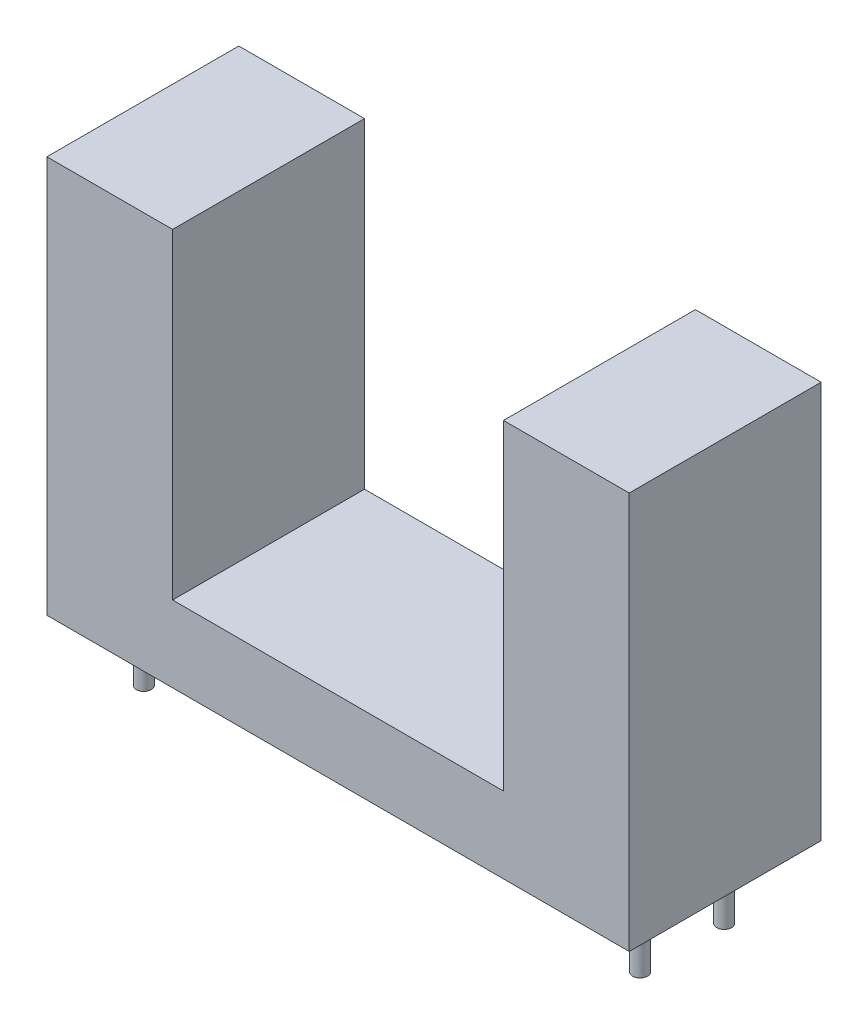
ISO-10303-21;
HEADER;
FILE_DESCRIPTION(('STEP AP214'),'2;1');
FILE_NAME('part.step','',(''),(''),'','','');
FILE_SCHEMA(('AUTOMOTIVE_DESIGN { 1 0 10303 214 1 1 1 1 }'));
ENDSEC;
DATA;
#1=APPLICATION_CONTEXT('core data for automotive mechanical design processes');
#2=APPLICATION_PROTOCOL_DEFINITION('international standard','automotive_design',2000,#1);
#3=PRODUCT_CONTEXT('',#1,'mechanical');
#4=PRODUCT('Part','Part','',(#3));
#5=PRODUCT_RELATED_PRODUCT_CATEGORY('part','',(#4));
#6=PRODUCT_DEFINITION_FORMATION('','',#4);
#7=PRODUCT_DEFINITION_CONTEXT('part definition',#1,'design');
#8=PRODUCT_DEFINITION('design','',#6,#7);
#9=PRODUCT_DEFINITION_SHAPE('','',#8);
#10=(LENGTH_UNIT() NAMED_UNIT(*) SI_UNIT(.MILLI.,.METRE.));
#11=(NAMED_UNIT(*) PLANE_ANGLE_UNIT() SI_UNIT($,.RADIAN.));
#12=(NAMED_UNIT(*) SI_UNIT($,.STERADIAN.) SOLID_ANGLE_UNIT());
#13=UNCERTAINTY_MEASURE_WITH_UNIT(LENGTH_MEASURE(1.E-05),#10,'distance_accuracy_value','');
#14=(GEOMETRIC_REPRESENTATION_CONTEXT(3) GLOBAL_UNCERTAINTY_ASSIGNED_CONTEXT((#13)) GLOBAL_UNIT_ASSIGNED_CONTEXT((#10,
#11,#12)) REPRESENTATION_CONTEXT('',''));
#15=CARTESIAN_POINT('',(0.,0.,0.));
#16=DIRECTION('',(0.,0.,1.));
#17=DIRECTION('',(1.,0.,0.));
#18=AXIS2_PLACEMENT_3D('',#15,#16,#17);
#19=CARTESIAN_POINT('',(0.,2.3,0.));
#20=DIRECTION('',(0.,1.,0.));
#21=DIRECTION('',(0.,0.,1.));
#22=AXIS2_PLACEMENT_3D('',#19,#20,#21);
#23=PLANE('',#22);
#24=DIRECTION('',(1.,0.,0.));
#25=VECTOR('',#24,1.);
#26=CARTESIAN_POINT('',(-8.8,2.3,2.9));
#27=LINE('',#26,#25);
#28=CARTESIAN_POINT('',(-5.,2.3,2.9));
#29=VERTEX_POINT('',#28);
#30=CARTESIAN_POINT('',(5.,2.3,2.9));
#31=VERTEX_POINT('',#30);
#32=EDGE_CURVE('E59',#29,#31,#27,.T.);
#33=ORIENTED_EDGE('',*,*,#32,.T.);
#34=DIRECTION('',(0.,0.,1.));
#35=VECTOR('',#34,1.);
#36=CARTESIAN_POINT('',(5.,2.3,-2.9));
#37=LINE('',#36,#35);
#38=CARTESIAN_POINT('',(5.,2.3,-2.9));
#39=VERTEX_POINT('',#38);
#40=EDGE_CURVE('E54',#39,#31,#37,.T.);
#41=ORIENTED_EDGE('',*,*,#40,.F.);
#42=DIRECTION('',(-1.,0.,0.));
#43=VECTOR('',#42,1.);
#44=CARTESIAN_POINT('',(-8.8,2.3,-2.9));
#45=LINE('',#44,#43);
#46=CARTESIAN_POINT('',(-5.,2.3,-2.9));
#47=VERTEX_POINT('',#46);
#48=EDGE_CURVE('E154',#39,#47,#45,.T.);
#49=ORIENTED_EDGE('',*,*,#48,.T.);
#50=DIRECTION('',(0.,0.,-1.));
#51=VECTOR('',#50,1.);
#52=CARTESIAN_POINT('',(-5.,2.3,-2.9));
#53=LINE('',#52,#51);
#54=EDGE_CURVE('E129',#29,#47,#53,.T.);
#55=ORIENTED_EDGE('',*,*,#54,.F.);
#56=EDGE_LOOP('',(#33,#41,#49,#55));
#57=FACE_BOUND('',#56,.T.);
#58=ADVANCED_FACE('F39',(#57),#23,.T.);
#59=CARTESIAN_POINT('',(-8.8,2.3,-2.9));
#60=DIRECTION('',(1.,0.,0.));
#61=DIRECTION('',(0.,0.,-1.));
#62=AXIS2_PLACEMENT_3D('',#59,#60,#61);
#63=PLANE('',#62);
#64=DIRECTION('',(0.,0.,1.));
#65=VECTOR('',#64,1.);
#66=CARTESIAN_POINT('',(-8.8,0.,-2.9));
#67=LINE('',#66,#65);
#68=CARTESIAN_POINT('',(-8.8,0.,-2.9));
#69=VERTEX_POINT('',#68);
#70=CARTESIAN_POINT('',(-8.8,0.,2.9));
#71=VERTEX_POINT('',#70);
#72=EDGE_CURVE('E152',#69,#71,#67,.T.);
#73=ORIENTED_EDGE('',*,*,#72,.T.);
#74=DIRECTION('',(0.,-1.,0.));
#75=VECTOR('',#74,1.);
#76=CARTESIAN_POINT('',(-8.8,2.3,2.9));
#77=LINE('',#76,#75);
#78=CARTESIAN_POINT('',(-8.8,12.,2.9));
#79=VERTEX_POINT('',#78);
#80=EDGE_CURVE('E112',#79,#71,#77,.T.);
#81=ORIENTED_EDGE('',*,*,#80,.F.);
#82=DIRECTION('',(0.,0.,1.));
#83=VECTOR('',#82,1.);
#84=CARTESIAN_POINT('',(-8.8,12.,-2.9));
#85=LINE('',#84,#83);
#86=CARTESIAN_POINT('',(-8.8,12.,-2.9));
#87=VERTEX_POINT('',#86);
#88=EDGE_CURVE('E134',#87,#79,#85,.T.);
#89=ORIENTED_EDGE('',*,*,#88,.F.);
#90=DIRECTION('',(0.,-1.,0.));
#91=VECTOR('',#90,1.);
#92=CARTESIAN_POINT('',(-8.8,2.3,-2.9));
#93=LINE('',#92,#91);
#94=EDGE_CURVE('E157',#87,#69,#93,.T.);
#95=ORIENTED_EDGE('',*,*,#94,.T.);
#96=EDGE_LOOP('',(#73,#81,#89,#95));
#97=FACE_BOUND('',#96,.T.);
#98=ADVANCED_FACE('F41',(#97),#63,.F.);
#99=CARTESIAN_POINT('',(-8.8,2.3,2.9));
#100=DIRECTION('',(0.,0.,-1.));
#101=DIRECTION('',(-1.,0.,0.));
#102=AXIS2_PLACEMENT_3D('',#99,#100,#101);
#103=PLANE('',#102);
#104=DIRECTION('',(1.,0.,0.));
#105=VECTOR('',#104,1.);
#106=CARTESIAN_POINT('',(-8.8,0.,2.9));
#107=LINE('',#106,#105);
#108=CARTESIAN_POINT('',(8.8,0.,2.9));
#109=VERTEX_POINT('',#108);
#110=EDGE_CURVE('E108',#71,#109,#107,.T.);
#111=ORIENTED_EDGE('',*,*,#110,.T.);
#112=DIRECTION('',(0.,-1.,0.));
#113=VECTOR('',#112,1.);
#114=CARTESIAN_POINT('',(8.8,2.3,2.9));
#115=LINE('',#114,#113);
#116=CARTESIAN_POINT('',(8.8,12.,2.9));
#117=VERTEX_POINT('',#116);
#118=EDGE_CURVE('E102',#117,#109,#115,.T.);
#119=ORIENTED_EDGE('',*,*,#118,.F.);
#120=DIRECTION('',(1.,0.,0.));
#121=VECTOR('',#120,1.);
#122=CARTESIAN_POINT('',(8.8,12.,2.9));
#123=LINE('',#122,#121);
#124=CARTESIAN_POINT('',(5.,12.,2.9));
#125=VERTEX_POINT('',#124);
#126=EDGE_CURVE('E106',#125,#117,#123,.T.);
#127=ORIENTED_EDGE('',*,*,#126,.F.);
#128=DIRECTION('',(0.,-1.,0.));
#129=VECTOR('',#128,1.);
#130=CARTESIAN_POINT('',(5.,12.,2.9));
#131=LINE('',#130,#129);
#132=EDGE_CURVE('E122',#125,#31,#131,.T.);
#133=ORIENTED_EDGE('',*,*,#132,.T.);
#134=ORIENTED_EDGE('',*,*,#32,.F.);
#135=DIRECTION('',(0.,-1.,0.));
#136=VECTOR('',#135,1.);
#137=CARTESIAN_POINT('',(-5.,12.,2.9));
#138=LINE('',#137,#136);
#139=CARTESIAN_POINT('',(-5.,12.,2.9));
#140=VERTEX_POINT('',#139);
#141=EDGE_CURVE('E149',#140,#29,#138,.T.);
#142=ORIENTED_EDGE('',*,*,#141,.F.);
#143=DIRECTION('',(1.,0.,0.));
#144=VECTOR('',#143,1.);
#145=CARTESIAN_POINT('',(-8.8,12.,2.9));
#146=LINE('',#145,#144);
#147=EDGE_CURVE('E137',#79,#140,#146,.T.);
#148=ORIENTED_EDGE('',*,*,#147,.F.);
#149=ORIENTED_EDGE('',*,*,#80,.T.);
#150=EDGE_LOOP('',(#111,#119,#127,#133,#134,#142,#148,#149));
#151=FACE_BOUND('',#150,.T.);
#152=ADVANCED_FACE('F104',(#151),#103,.F.);
#153=CARTESIAN_POINT('',(8.8,2.3,-2.9));
#154=DIRECTION('',(-1.,0.,0.));
#155=DIRECTION('',(0.,0.,1.));
#156=AXIS2_PLACEMENT_3D('',#153,#154,#155);
#157=PLANE('',#156);
#158=DIRECTION('',(0.,0.,-1.));
#159=VECTOR('',#158,1.);
#160=CARTESIAN_POINT('',(8.8,0.,-2.9));
#161=LINE('',#160,#159);
#162=CARTESIAN_POINT('',(8.8,0.,-2.9));
#163=VERTEX_POINT('',#162);
#164=EDGE_CURVE('E161',#109,#163,#161,.T.);
#165=ORIENTED_EDGE('',*,*,#164,.T.);
#166=DIRECTION('',(0.,-1.,0.));
#167=VECTOR('',#166,1.);
#168=CARTESIAN_POINT('',(8.8,2.3,-2.9));
#169=LINE('',#168,#167);
#170=CARTESIAN_POINT('',(8.8,12.,-2.9));
#171=VERTEX_POINT('',#170);
#172=EDGE_CURVE('E113',#171,#163,#169,.T.);
#173=ORIENTED_EDGE('',*,*,#172,.F.);
#174=DIRECTION('',(0.,0.,-1.));
#175=VECTOR('',#174,1.);
#176=CARTESIAN_POINT('',(8.8,12.,-2.9));
#177=LINE('',#176,#175);
#178=EDGE_CURVE('E118',#117,#171,#177,.T.);
#179=ORIENTED_EDGE('',*,*,#178,.F.);
#180=ORIENTED_EDGE('',*,*,#118,.T.);
#181=EDGE_LOOP('',(#165,#173,#179,#180));
#182=FACE_BOUND('',#181,.T.);
#183=ADVANCED_FACE('F124',(#182),#157,.F.);
#184=CARTESIAN_POINT('',(-8.8,2.3,-2.9));
#185=DIRECTION('',(0.,0.,1.));
#186=DIRECTION('',(1.,0.,0.));
#187=AXIS2_PLACEMENT_3D('',#184,#185,#186);
#188=PLANE('',#187);
#189=DIRECTION('',(-1.,0.,0.));
#190=VECTOR('',#189,1.);
#191=CARTESIAN_POINT('',(-8.8,0.,-2.9));
#192=LINE('',#191,#190);
#193=EDGE_CURVE('E155',#163,#69,#192,.T.);
#194=ORIENTED_EDGE('',*,*,#193,.T.);
#195=ORIENTED_EDGE('',*,*,#94,.F.);
#196=DIRECTION('',(-1.,0.,0.));
#197=VECTOR('',#196,1.);
#198=CARTESIAN_POINT('',(-8.8,12.,-2.9));
#199=LINE('',#198,#197);
#200=CARTESIAN_POINT('',(-5.,12.,-2.9));
#201=VERTEX_POINT('',#200);
#202=EDGE_CURVE('E141',#201,#87,#199,.T.);
#203=ORIENTED_EDGE('',*,*,#202,.F.);
#204=DIRECTION('',(0.,-1.,0.));
#205=VECTOR('',#204,1.);
#206=CARTESIAN_POINT('',(-5.,12.,-2.9));
#207=LINE('',#206,#205);
#208=EDGE_CURVE('E144',#201,#47,#207,.T.);
#209=ORIENTED_EDGE('',*,*,#208,.T.);
#210=ORIENTED_EDGE('',*,*,#48,.F.);
#211=DIRECTION('',(0.,-1.,0.));
#212=VECTOR('',#211,1.);
#213=CARTESIAN_POINT('',(5.,12.,-2.9));
#214=LINE('',#213,#212);
#215=CARTESIAN_POINT('',(5.,12.,-2.9));
#216=VERTEX_POINT('',#215);
#217=EDGE_CURVE('E204',#216,#39,#214,.T.);
#218=ORIENTED_EDGE('',*,*,#217,.F.);
#219=DIRECTION('',(-1.,0.,0.));
#220=VECTOR('',#219,1.);
#221=CARTESIAN_POINT('',(8.8,12.,-2.9));
#222=LINE('',#221,#220);
#223=EDGE_CURVE('E127',#171,#216,#222,.T.);
#224=ORIENTED_EDGE('',*,*,#223,.F.);
#225=ORIENTED_EDGE('',*,*,#172,.T.);
#226=EDGE_LOOP('',(#194,#195,#203,#209,#210,#218,#224,#225));
#227=FACE_BOUND('',#226,.T.);
#228=ADVANCED_FACE('F182',(#227),#188,.F.);
#229=CARTESIAN_POINT('',(0.,0.,0.));
#230=DIRECTION('',(0.,1.,0.));
#231=DIRECTION('',(0.,0.,1.));
#232=AXIS2_PLACEMENT_3D('',#229,#230,#231);
#233=PLANE('',#232);
#234=CARTESIAN_POINT('',(7.5,0.,-1.27));
#235=DIRECTION('',(0.,1.,0.));
#236=DIRECTION('',(0.,0.,1.));
#237=AXIS2_PLACEMENT_3D('',#234,#235,#236);
#238=CIRCLE('',#237,0.225);
#239=CARTESIAN_POINT('',(7.5,0.,-1.045));
#240=VERTEX_POINT('',#239);
#241=EDGE_CURVE('E11',#240,#240,#238,.F.);
#242=ORIENTED_EDGE('',*,*,#241,.F.);
#243=EDGE_LOOP('',(#242));
#244=FACE_BOUND('',#243,.T.);
#245=CARTESIAN_POINT('',(7.5,0.,1.27));
#246=DIRECTION('',(0.,1.,0.));
#247=DIRECTION('',(0.,0.,1.));
#248=AXIS2_PLACEMENT_3D('',#245,#246,#247);
#249=CIRCLE('',#248,0.225);
#250=CARTESIAN_POINT('',(7.5,0.,1.495));
#251=VERTEX_POINT('',#250);
#252=EDGE_CURVE('E47',#251,#251,#249,.F.);
#253=ORIENTED_EDGE('',*,*,#252,.F.);
#254=EDGE_LOOP('',(#253));
#255=FACE_BOUND('',#254,.T.);
#256=CARTESIAN_POINT('',(-7.5,0.,-1.27));
#257=DIRECTION('',(0.,1.,0.));
#258=DIRECTION('',(0.,0.,1.));
#259=AXIS2_PLACEMENT_3D('',#256,#257,#258);
#260=CIRCLE('',#259,0.224999999999999);
#261=CARTESIAN_POINT('',(-7.5,0.,-1.045));
#262=VERTEX_POINT('',#261);
#263=EDGE_CURVE('E171',#262,#262,#260,.F.);
#264=ORIENTED_EDGE('',*,*,#263,.F.);
#265=EDGE_LOOP('',(#264));
#266=FACE_BOUND('',#265,.T.);
#267=CARTESIAN_POINT('',(-7.5,0.,1.27));
#268=DIRECTION('',(0.,1.,0.));
#269=DIRECTION('',(0.,0.,1.));
#270=AXIS2_PLACEMENT_3D('',#267,#268,#269);
#271=CIRCLE('',#270,0.225);
#272=CARTESIAN_POINT('',(-7.5,0.,1.495));
#273=VERTEX_POINT('',#272);
#274=EDGE_CURVE('E168',#273,#273,#271,.F.);
#275=ORIENTED_EDGE('',*,*,#274,.F.);
#276=EDGE_LOOP('',(#275));
#277=FACE_BOUND('',#276,.T.);
#278=ORIENTED_EDGE('',*,*,#72,.F.);
#279=ORIENTED_EDGE('',*,*,#193,.F.);
#280=ORIENTED_EDGE('',*,*,#164,.F.);
#281=ORIENTED_EDGE('',*,*,#110,.F.);
#282=EDGE_LOOP('',(#278,#279,#280,#281));
#283=FACE_BOUND('',#282,.T.);
#284=ADVANCED_FACE('F178',(#244,#255,#266,#277,#283),#233,.F.);
#285=CARTESIAN_POINT('',(-5.,12.,-2.9));
#286=DIRECTION('',(-1.,0.,0.));
#287=DIRECTION('',(0.,0.,1.));
#288=AXIS2_PLACEMENT_3D('',#285,#286,#287);
#289=PLANE('',#288);
#290=ORIENTED_EDGE('',*,*,#54,.T.);
#291=ORIENTED_EDGE('',*,*,#208,.F.);
#292=DIRECTION('',(0.,0.,-1.));
#293=VECTOR('',#292,1.);
#294=CARTESIAN_POINT('',(-5.,12.,-2.9));
#295=LINE('',#294,#293);
#296=EDGE_CURVE('E139',#140,#201,#295,.T.);
#297=ORIENTED_EDGE('',*,*,#296,.F.);
#298=ORIENTED_EDGE('',*,*,#141,.T.);
#299=EDGE_LOOP('',(#290,#291,#297,#298));
#300=FACE_BOUND('',#299,.T.);
#301=ADVANCED_FACE('F181',(#300),#289,.F.);
#302=CARTESIAN_POINT('',(0.,12.,0.));
#303=DIRECTION('',(0.,1.,0.));
#304=DIRECTION('',(0.,0.,1.));
#305=AXIS2_PLACEMENT_3D('',#302,#303,#304);
#306=PLANE('',#305);
#307=ORIENTED_EDGE('',*,*,#88,.T.);
#308=ORIENTED_EDGE('',*,*,#147,.T.);
#309=ORIENTED_EDGE('',*,*,#296,.T.);
#310=ORIENTED_EDGE('',*,*,#202,.T.);
#311=EDGE_LOOP('',(#307,#308,#309,#310));
#312=FACE_BOUND('',#311,.T.);
#313=ADVANCED_FACE('F197',(#312),#306,.T.);
#314=CARTESIAN_POINT('',(5.,12.,-2.9));
#315=DIRECTION('',(1.,0.,0.));
#316=DIRECTION('',(0.,0.,-1.));
#317=AXIS2_PLACEMENT_3D('',#314,#315,#316);
#318=PLANE('',#317);
#319=ORIENTED_EDGE('',*,*,#40,.T.);
#320=ORIENTED_EDGE('',*,*,#132,.F.);
#321=DIRECTION('',(0.,0.,1.));
#322=VECTOR('',#321,1.);
#323=CARTESIAN_POINT('',(5.,12.,-2.9));
#324=LINE('',#323,#322);
#325=EDGE_CURVE('E120',#216,#125,#324,.T.);
#326=ORIENTED_EDGE('',*,*,#325,.F.);
#327=ORIENTED_EDGE('',*,*,#217,.T.);
#328=EDGE_LOOP('',(#319,#320,#326,#327));
#329=FACE_BOUND('',#328,.T.);
#330=ADVANCED_FACE('F206',(#329),#318,.F.);
#331=CARTESIAN_POINT('',(0.,12.,0.));
#332=DIRECTION('',(0.,-1.,0.));
#333=DIRECTION('',(0.,0.,-1.));
#334=AXIS2_PLACEMENT_3D('',#331,#332,#333);
#335=PLANE('',#334);
#336=ORIENTED_EDGE('',*,*,#178,.T.);
#337=ORIENTED_EDGE('',*,*,#223,.T.);
#338=ORIENTED_EDGE('',*,*,#325,.T.);
#339=ORIENTED_EDGE('',*,*,#126,.T.);
#340=EDGE_LOOP('',(#336,#337,#338,#339));
#341=FACE_BOUND('',#340,.T.);
#342=ADVANCED_FACE('F117',(#341),#335,.F.);
#343=CARTESIAN_POINT('',(-7.5,-2.,1.27));
#344=DIRECTION('',(0.,1.,0.));
#345=DIRECTION('',(0.,0.,1.));
#346=AXIS2_PLACEMENT_3D('',#343,#344,#345);
#347=CYLINDRICAL_SURFACE('',#346,0.225);
#348=CARTESIAN_POINT('',(-7.5,-2.,1.27));
#349=DIRECTION('',(0.,-1.,0.));
#350=DIRECTION('',(0.,0.,-1.));
#351=AXIS2_PLACEMENT_3D('',#348,#349,#350);
#352=CIRCLE('',#351,0.225);
#353=CARTESIAN_POINT('',(-7.5,-2.,1.045));
#354=VERTEX_POINT('',#353);
#355=EDGE_CURVE('E207',#354,#354,#352,.T.);
#356=ORIENTED_EDGE('',*,*,#355,.F.);
#357=EDGE_LOOP('',(#356));
#358=FACE_BOUND('',#357,.T.);
#359=ORIENTED_EDGE('',*,*,#274,.T.);
#360=EDGE_LOOP('',(#359));
#361=FACE_BOUND('',#360,.T.);
#362=ADVANCED_FACE('F289',(#358,#361),#347,.T.);
#363=CARTESIAN_POINT('',(-7.5,-2.,1.27));
#364=DIRECTION('',(0.,-1.,0.));
#365=DIRECTION('',(0.,0.,-1.));
#366=AXIS2_PLACEMENT_3D('',#363,#364,#365);
#367=PLANE('',#366);
#368=ORIENTED_EDGE('',*,*,#355,.T.);
#369=EDGE_LOOP('',(#368));
#370=FACE_BOUND('',#369,.T.);
#371=ADVANCED_FACE('F305',(#370),#367,.T.);
#372=CARTESIAN_POINT('',(-7.5,-2.,-1.27));
#373=DIRECTION('',(0.,1.,0.));
#374=DIRECTION('',(0.,0.,1.));
#375=AXIS2_PLACEMENT_3D('',#372,#373,#374);
#376=CYLINDRICAL_SURFACE('',#375,0.224999999999999);
#377=CARTESIAN_POINT('',(-7.5,-2.,-1.27));
#378=DIRECTION('',(0.,-1.,0.));
#379=DIRECTION('',(0.,0.,-1.));
#380=AXIS2_PLACEMENT_3D('',#377,#378,#379);
#381=CIRCLE('',#380,0.224999999999999);
#382=CARTESIAN_POINT('',(-7.5,-2.,-1.495));
#383=VERTEX_POINT('',#382);
#384=EDGE_CURVE('E211',#383,#383,#381,.T.);
#385=ORIENTED_EDGE('',*,*,#384,.F.);
#386=EDGE_LOOP('',(#385));
#387=FACE_BOUND('',#386,.T.);
#388=ORIENTED_EDGE('',*,*,#263,.T.);
#389=EDGE_LOOP('',(#388));
#390=FACE_BOUND('',#389,.T.);
#391=ADVANCED_FACE('F314',(#387,#390),#376,.T.);
#392=CARTESIAN_POINT('',(-7.5,-2.,-1.27));
#393=DIRECTION('',(0.,-1.,0.));
#394=DIRECTION('',(0.,0.,-1.));
#395=AXIS2_PLACEMENT_3D('',#392,#393,#394);
#396=PLANE('',#395);
#397=ORIENTED_EDGE('',*,*,#384,.T.);
#398=EDGE_LOOP('',(#397));
#399=FACE_BOUND('',#398,.T.);
#400=ADVANCED_FACE('F323',(#399),#396,.T.);
#401=CARTESIAN_POINT('',(7.5,-2.,1.27));
#402=DIRECTION('',(0.,1.,0.));
#403=DIRECTION('',(0.,0.,1.));
#404=AXIS2_PLACEMENT_3D('',#401,#402,#403);
#405=CYLINDRICAL_SURFACE('',#404,0.225);
#406=CARTESIAN_POINT('',(7.5,-2.,1.27));
#407=DIRECTION('',(0.,-1.,0.));
#408=DIRECTION('',(0.,0.,-1.));
#409=AXIS2_PLACEMENT_3D('',#406,#407,#408);
#410=CIRCLE('',#409,0.225);
#411=CARTESIAN_POINT('',(7.5,-2.,1.045));
#412=VERTEX_POINT('',#411);
#413=EDGE_CURVE('E216',#412,#412,#410,.T.);
#414=ORIENTED_EDGE('',*,*,#413,.F.);
#415=EDGE_LOOP('',(#414));
#416=FACE_BOUND('',#415,.T.);
#417=ORIENTED_EDGE('',*,*,#252,.T.);
#418=EDGE_LOOP('',(#417));
#419=FACE_BOUND('',#418,.T.);
#420=ADVANCED_FACE('F176',(#416,#419),#405,.T.);
#421=CARTESIAN_POINT('',(7.5,-2.,1.27));
#422=DIRECTION('',(0.,-1.,0.));
#423=DIRECTION('',(0.,0.,-1.));
#424=AXIS2_PLACEMENT_3D('',#421,#422,#423);
#425=PLANE('',#424);
#426=ORIENTED_EDGE('',*,*,#413,.T.);
#427=EDGE_LOOP('',(#426));
#428=FACE_BOUND('',#427,.T.);
#429=ADVANCED_FACE('F228',(#428),#425,.T.);
#430=CARTESIAN_POINT('',(7.5,-2.,-1.27));
#431=DIRECTION('',(0.,1.,0.));
#432=DIRECTION('',(0.,0.,1.));
#433=AXIS2_PLACEMENT_3D('',#430,#431,#432);
#434=CYLINDRICAL_SURFACE('',#433,0.225);
#435=CARTESIAN_POINT('',(7.5,-2.,-1.27));
#436=DIRECTION('',(0.,-1.,0.));
#437=DIRECTION('',(0.,0.,-1.));
#438=AXIS2_PLACEMENT_3D('',#435,#436,#437);
#439=CIRCLE('',#438,0.225);
#440=CARTESIAN_POINT('',(7.5,-2.,-1.495));
#441=VERTEX_POINT('',#440);
#442=EDGE_CURVE('E219',#441,#441,#439,.T.);
#443=ORIENTED_EDGE('',*,*,#442,.F.);
#444=EDGE_LOOP('',(#443));
#445=FACE_BOUND('',#444,.T.);
#446=ORIENTED_EDGE('',*,*,#241,.T.);
#447=EDGE_LOOP('',(#446));
#448=FACE_BOUND('',#447,.T.);
#449=ADVANCED_FACE('F225',(#445,#448),#434,.T.);
#450=CARTESIAN_POINT('',(7.5,-2.,-1.27));
#451=DIRECTION('',(0.,-1.,0.));
#452=DIRECTION('',(0.,0.,-1.));
#453=AXIS2_PLACEMENT_3D('',#450,#451,#452);
#454=PLANE('',#453);
#455=ORIENTED_EDGE('',*,*,#442,.T.);
#456=EDGE_LOOP('',(#455));
#457=FACE_BOUND('',#456,.T.);
#458=ADVANCED_FACE('F223',(#457),#454,.T.);
#459=CLOSED_SHELL('',(#58,#98,#152,#183,#228,#284,#301,#313,#330,#342,#362,#371,#391,#400,#420,
#429,#449,#458));
#460=MANIFOLD_SOLID_BREP('B2',#459);
#461=ADVANCED_BREP_SHAPE_REPRESENTATION('',(#18,#460),#14);
#462=SHAPE_DEFINITION_REPRESENTATION(#9,#461);
ENDSEC;
END-ISO-10303-21;
